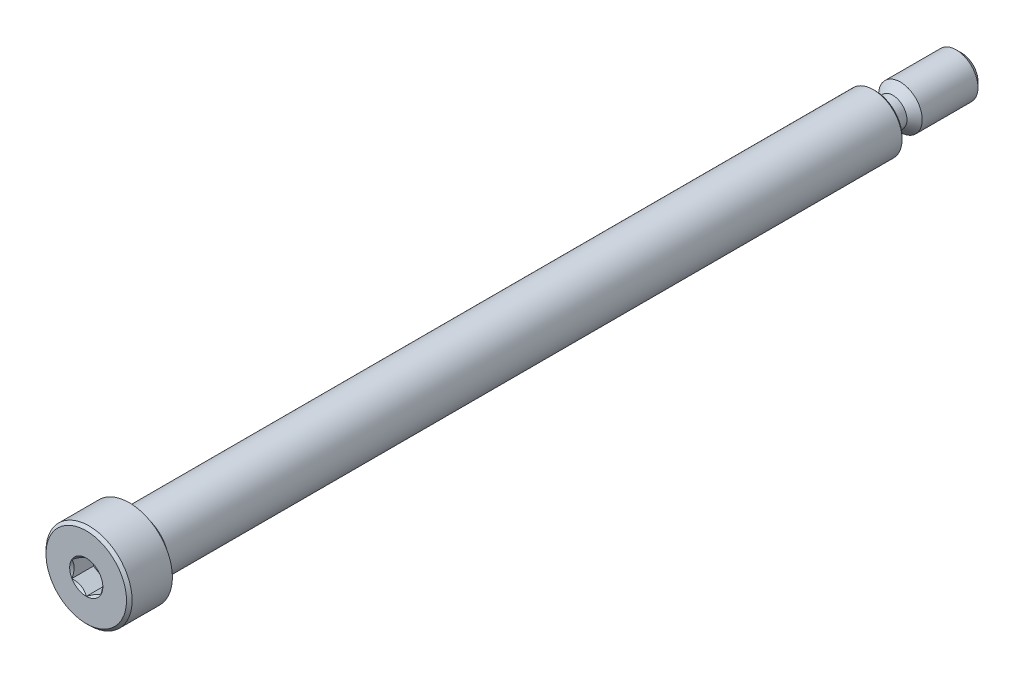
ISO-10303-21;
HEADER;
FILE_DESCRIPTION(('STEP AP214'),'2;1');
FILE_NAME('part.step','',(''),(''),'','','');
FILE_SCHEMA(('AUTOMOTIVE_DESIGN { 1 0 10303 214 1 1 1 1 }'));
ENDSEC;
DATA;
#1=APPLICATION_CONTEXT('core data for automotive mechanical design processes');
#2=APPLICATION_PROTOCOL_DEFINITION('international standard','automotive_design',2000,#1);
#3=PRODUCT_CONTEXT('',#1,'mechanical');
#4=PRODUCT('Part','Part','',(#3));
#5=PRODUCT_RELATED_PRODUCT_CATEGORY('part','',(#4));
#6=PRODUCT_DEFINITION_FORMATION('','',#4);
#7=PRODUCT_DEFINITION_CONTEXT('part definition',#1,'design');
#8=PRODUCT_DEFINITION('design','',#6,#7);
#9=PRODUCT_DEFINITION_SHAPE('','',#8);
#10=(LENGTH_UNIT() NAMED_UNIT(*) SI_UNIT(.MILLI.,.METRE.));
#11=(NAMED_UNIT(*) PLANE_ANGLE_UNIT() SI_UNIT($,.RADIAN.));
#12=(NAMED_UNIT(*) SI_UNIT($,.STERADIAN.) SOLID_ANGLE_UNIT());
#13=UNCERTAINTY_MEASURE_WITH_UNIT(LENGTH_MEASURE(1.E-05),#10,'distance_accuracy_value','');
#14=(GEOMETRIC_REPRESENTATION_CONTEXT(3) GLOBAL_UNCERTAINTY_ASSIGNED_CONTEXT((#13)) GLOBAL_UNIT_ASSIGNED_CONTEXT((#10,
#11,#12)) REPRESENTATION_CONTEXT('',''));
#15=CARTESIAN_POINT('',(0.,0.,0.));
#16=DIRECTION('',(0.,0.,1.));
#17=DIRECTION('',(1.,0.,0.));
#18=AXIS2_PLACEMENT_3D('',#15,#16,#17);
#19=CARTESIAN_POINT('',(0.,0.,-87.3125));
#20=DIRECTION('',(0.,0.,-1.));
#21=DIRECTION('',(-1.,0.,0.));
#22=AXIS2_PLACEMENT_3D('',#19,#20,#21);
#23=PLANE('',#22);
#24=CARTESIAN_POINT('',(0.,0.,-87.3125));
#25=DIRECTION('',(0.,0.,-1.));
#26=DIRECTION('',(-1.,0.,0.));
#27=AXIS2_PLACEMENT_3D('',#24,#25,#26);
#28=CIRCLE('',#27,1.83303333333333);
#29=CARTESIAN_POINT('',(-1.83303333333333,0.,-87.3125));
#30=VERTEX_POINT('',#29);
#31=EDGE_CURVE('E56',#30,#30,#28,.F.);
#32=ORIENTED_EDGE('',*,*,#31,.T.);
#33=EDGE_LOOP('',(#32));
#34=FACE_BOUND('',#33,.T.);
#35=CARTESIAN_POINT('',(0.,0.,-87.3125));
#36=DIRECTION('',(0.,0.,-1.));
#37=DIRECTION('',(-1.,0.,0.));
#38=AXIS2_PLACEMENT_3D('',#35,#36,#37);
#39=CIRCLE('',#38,2.93687499999999);
#40=CARTESIAN_POINT('',(-2.93687499999999,0.,-87.3125));
#41=VERTEX_POINT('',#40);
#42=EDGE_CURVE('E304',#41,#41,#39,.T.);
#43=ORIENTED_EDGE('',*,*,#42,.T.);
#44=EDGE_LOOP('',(#43));
#45=FACE_BOUND('',#44,.T.);
#46=ADVANCED_FACE('F41',(#34,#45),#23,.T.);
#47=CARTESIAN_POINT('',(0.,0.,-87.3125));
#48=DIRECTION('',(0.,0.,1.));
#49=DIRECTION('',(1.,0.,0.));
#50=AXIS2_PLACEMENT_3D('',#47,#48,#49);
#51=CONICAL_SURFACE('',#50,2.93687499999999,0.785398163397436);
#52=CARTESIAN_POINT('',(0.,0.,-87.074375));
#53=DIRECTION('',(0.,0.,-1.));
#54=DIRECTION('',(-1.,0.,0.));
#55=AXIS2_PLACEMENT_3D('',#52,#53,#54);
#56=CIRCLE('',#55,3.17499999999999);
#57=CARTESIAN_POINT('',(-3.17499999999999,0.,-87.074375));
#58=VERTEX_POINT('',#57);
#59=EDGE_CURVE('E300',#58,#58,#56,.T.);
#60=ORIENTED_EDGE('',*,*,#59,.T.);
#61=EDGE_LOOP('',(#60));
#62=FACE_BOUND('',#61,.T.);
#63=ORIENTED_EDGE('',*,*,#42,.F.);
#64=EDGE_LOOP('',(#63));
#65=FACE_BOUND('',#64,.T.);
#66=ADVANCED_FACE('F212',(#62,#65),#51,.T.);
#67=CARTESIAN_POINT('',(0.,0.,-87.3125));
#68=DIRECTION('',(0.,0.,-1.));
#69=DIRECTION('',(-1.,0.,0.));
#70=AXIS2_PLACEMENT_3D('',#67,#68,#69);
#71=CYLINDRICAL_SURFACE('',#70,3.17499999999999);
#72=CARTESIAN_POINT('',(0.,0.,-5.95312500000002));
#73=DIRECTION('',(0.,0.,-1.));
#74=DIRECTION('',(-1.,0.,0.));
#75=AXIS2_PLACEMENT_3D('',#72,#73,#74);
#76=CIRCLE('',#75,3.17499999999999);
#77=CARTESIAN_POINT('',(-3.17499999999999,0.,-5.95312500000002));
#78=VERTEX_POINT('',#77);
#79=EDGE_CURVE('E296',#78,#78,#76,.T.);
#80=ORIENTED_EDGE('',*,*,#79,.T.);
#81=EDGE_LOOP('',(#80));
#82=FACE_BOUND('',#81,.T.);
#83=ORIENTED_EDGE('',*,*,#59,.F.);
#84=EDGE_LOOP('',(#83));
#85=FACE_BOUND('',#84,.T.);
#86=ADVANCED_FACE('F218',(#82,#85),#71,.T.);
#87=CARTESIAN_POINT('',(0.,0.,-5.95312500000002));
#88=DIRECTION('',(0.,0.,-1.));
#89=DIRECTION('',(-1.,0.,0.));
#90=AXIS2_PLACEMENT_3D('',#87,#88,#89);
#91=CONICAL_SURFACE('',#90,3.17499999999999,0.785398163397436);
#92=CARTESIAN_POINT('',(0.,0.,-5.71500000000001));
#93=DIRECTION('',(0.,0.,-1.));
#94=DIRECTION('',(-1.,0.,0.));
#95=AXIS2_PLACEMENT_3D('',#92,#93,#94);
#96=CIRCLE('',#95,2.93687499999999);
#97=CARTESIAN_POINT('',(-2.93687499999999,0.,-5.71500000000001));
#98=VERTEX_POINT('',#97);
#99=EDGE_CURVE('E292',#98,#98,#96,.T.);
#100=ORIENTED_EDGE('',*,*,#99,.T.);
#101=EDGE_LOOP('',(#100));
#102=FACE_BOUND('',#101,.T.);
#103=ORIENTED_EDGE('',*,*,#79,.F.);
#104=EDGE_LOOP('',(#103));
#105=FACE_BOUND('',#104,.T.);
#106=ADVANCED_FACE('F333',(#102,#105),#91,.T.);
#107=CARTESIAN_POINT('',(0.,0.,-87.3125));
#108=DIRECTION('',(0.,0.,-1.));
#109=DIRECTION('',(-1.,0.,0.));
#110=AXIS2_PLACEMENT_3D('',#107,#108,#109);
#111=CYLINDRICAL_SURFACE('',#110,2.93687499999999);
#112=CARTESIAN_POINT('',(0.,0.,-4.7625));
#113=DIRECTION('',(0.,0.,-1.));
#114=DIRECTION('',(-1.,0.,0.));
#115=AXIS2_PLACEMENT_3D('',#112,#113,#114);
#116=CIRCLE('',#115,2.93687499999999);
#117=CARTESIAN_POINT('',(-2.93687499999999,0.,-4.7625));
#118=VERTEX_POINT('',#117);
#119=EDGE_CURVE('E288',#118,#118,#116,.T.);
#120=ORIENTED_EDGE('',*,*,#119,.T.);
#121=EDGE_LOOP('',(#120));
#122=FACE_BOUND('',#121,.T.);
#123=ORIENTED_EDGE('',*,*,#99,.F.);
#124=EDGE_LOOP('',(#123));
#125=FACE_BOUND('',#124,.T.);
#126=ADVANCED_FACE('F329',(#122,#125),#111,.T.);
#127=CARTESIAN_POINT('',(0.,4.76249999999999,-4.7625));
#128=DIRECTION('',(0.,0.,-1.));
#129=DIRECTION('',(-1.,0.,0.));
#130=AXIS2_PLACEMENT_3D('',#127,#128,#129);
#131=PLANE('',#130);
#132=CARTESIAN_POINT('',(0.,0.,-4.76249999999999));
#133=DIRECTION('',(0.,0.,-1.));
#134=DIRECTION('',(-1.,0.,0.));
#135=AXIS2_PLACEMENT_3D('',#132,#133,#134);
#136=CIRCLE('',#135,4.76249999999999);
#137=CARTESIAN_POINT('',(-4.76249999999999,0.,-4.76249999999999));
#138=VERTEX_POINT('',#137);
#139=EDGE_CURVE('E279',#138,#138,#136,.T.);
#140=ORIENTED_EDGE('',*,*,#139,.T.);
#141=EDGE_LOOP('',(#140));
#142=FACE_BOUND('',#141,.T.);
#143=ORIENTED_EDGE('',*,*,#119,.F.);
#144=EDGE_LOOP('',(#143));
#145=FACE_BOUND('',#144,.T.);
#146=ADVANCED_FACE('F326',(#142,#145),#131,.T.);
#147=CARTESIAN_POINT('',(0.,0.,-87.3125));
#148=DIRECTION('',(0.,0.,-1.));
#149=DIRECTION('',(-1.,0.,0.));
#150=AXIS2_PLACEMENT_3D('',#147,#148,#149);
#151=CYLINDRICAL_SURFACE('',#150,4.76249999999999);
#152=CARTESIAN_POINT('',(0.,0.,-0.309562499999999));
#153=DIRECTION('',(0.,0.,1.));
#154=DIRECTION('',(1.,0.,0.));
#155=AXIS2_PLACEMENT_3D('',#152,#153,#154);
#156=CIRCLE('',#155,4.76249999999999);
#157=CARTESIAN_POINT('',(4.76249999999999,0.,-0.309562499999999));
#158=VERTEX_POINT('',#157);
#159=EDGE_CURVE('E242',#158,#158,#156,.F.);
#160=ORIENTED_EDGE('',*,*,#159,.T.);
#161=EDGE_LOOP('',(#160));
#162=FACE_BOUND('',#161,.T.);
#163=ORIENTED_EDGE('',*,*,#139,.F.);
#164=EDGE_LOOP('',(#163));
#165=FACE_BOUND('',#164,.T.);
#166=ADVANCED_FACE('F323',(#162,#165),#151,.T.);
#167=CARTESIAN_POINT('',(0.,0.,0.));
#168=DIRECTION('',(0.,0.,1.));
#169=DIRECTION('',(1.,0.,0.));
#170=AXIS2_PLACEMENT_3D('',#167,#168,#169);
#171=PLANE('',#170);
#172=CARTESIAN_POINT('',(0.,0.,0.));
#173=DIRECTION('',(0.,0.,1.));
#174=DIRECTION('',(1.,0.,0.));
#175=AXIS2_PLACEMENT_3D('',#172,#173,#174);
#176=CIRCLE('',#175,1.83308710467706);
#177=CARTESIAN_POINT('',(1.5875,0.916543552338532,0.));
#178=VERTEX_POINT('',#177);
#179=CARTESIAN_POINT('',(0.,1.83308710467706,0.));
#180=VERTEX_POINT('',#179);
#181=EDGE_CURVE('E114',#178,#180,#176,.T.);
#182=ORIENTED_EDGE('',*,*,#181,.F.);
#183=CARTESIAN_POINT('',(1.5875,-0.916543552338531,0.));
#184=VERTEX_POINT('',#183);
#185=EDGE_CURVE('E102',#184,#178,#176,.T.);
#186=ORIENTED_EDGE('',*,*,#185,.F.);
#187=CARTESIAN_POINT('',(0.,-1.83308710467706,0.));
#188=VERTEX_POINT('',#187);
#189=EDGE_CURVE('E112',#188,#184,#176,.T.);
#190=ORIENTED_EDGE('',*,*,#189,.F.);
#191=CARTESIAN_POINT('',(-1.5875,-0.916543552338531,0.));
#192=VERTEX_POINT('',#191);
#193=EDGE_CURVE('E62',#192,#188,#176,.T.);
#194=ORIENTED_EDGE('',*,*,#193,.F.);
#195=CARTESIAN_POINT('',(-1.5875,0.916543552338531,0.));
#196=VERTEX_POINT('',#195);
#197=EDGE_CURVE('E69',#196,#192,#176,.T.);
#198=ORIENTED_EDGE('',*,*,#197,.F.);
#199=EDGE_CURVE('E143',#180,#196,#176,.T.);
#200=ORIENTED_EDGE('',*,*,#199,.F.);
#201=EDGE_LOOP('',(#182,#186,#190,#194,#198,#200));
#202=FACE_BOUND('',#201,.T.);
#203=CARTESIAN_POINT('',(0.,0.,0.));
#204=DIRECTION('',(0.,0.,1.));
#205=DIRECTION('',(1.,0.,0.));
#206=AXIS2_PLACEMENT_3D('',#203,#204,#205);
#207=CIRCLE('',#206,4.45293749999999);
#208=CARTESIAN_POINT('',(4.45293749999999,0.,0.));
#209=VERTEX_POINT('',#208);
#210=EDGE_CURVE('E239',#209,#209,#207,.T.);
#211=ORIENTED_EDGE('',*,*,#210,.T.);
#212=EDGE_LOOP('',(#211));
#213=FACE_BOUND('',#212,.T.);
#214=ADVANCED_FACE('F141',(#202,#213),#171,.T.);
#215=CARTESIAN_POINT('',(0.,0.,-89.2175));
#216=DIRECTION('',(0.,0.,-1.));
#217=DIRECTION('',(0.,1.,0.));
#218=AXIS2_PLACEMENT_3D('',#215,#216,#217);
#219=CONICAL_SURFACE('',#218,1.56844999999999,0.785398163397449);
#220=CARTESIAN_POINT('',(0.,0.,-90.06205));
#221=DIRECTION('',(0.,0.,-1.));
#222=DIRECTION('',(0.,1.,0.));
#223=AXIS2_PLACEMENT_3D('',#220,#221,#222);
#224=CIRCLE('',#223,2.41299999999999);
#225=CARTESIAN_POINT('',(0.,2.413,-90.06205));
#226=VERTEX_POINT('',#225);
#227=EDGE_CURVE('E274',#226,#226,#224,.T.);
#228=ORIENTED_EDGE('',*,*,#227,.F.);
#229=EDGE_LOOP('',(#228));
#230=FACE_BOUND('',#229,.T.);
#231=CARTESIAN_POINT('',(0.,0.,-89.2175));
#232=DIRECTION('',(0.,0.,-1.));
#233=DIRECTION('',(0.,1.,0.));
#234=AXIS2_PLACEMENT_3D('',#231,#232,#233);
#235=CIRCLE('',#234,1.56844999999999);
#236=CARTESIAN_POINT('',(0.,1.56845,-89.2175));
#237=VERTEX_POINT('',#236);
#238=EDGE_CURVE('E271',#237,#237,#235,.T.);
#239=ORIENTED_EDGE('',*,*,#238,.T.);
#240=EDGE_LOOP('',(#239));
#241=FACE_BOUND('',#240,.T.);
#242=ADVANCED_FACE('F267',(#230,#241),#219,.T.);
#243=CARTESIAN_POINT('',(0.,0.,-87.3125));
#244=DIRECTION('',(0.,0.,-1.));
#245=DIRECTION('',(0.,1.,0.));
#246=AXIS2_PLACEMENT_3D('',#243,#244,#245);
#247=CYLINDRICAL_SURFACE('',#246,1.56844999999999);
#248=CARTESIAN_POINT('',(0.,0.,-87.5770833333333));
#249=DIRECTION('',(0.,0.,-1.));
#250=DIRECTION('',(-1.,0.,0.));
#251=AXIS2_PLACEMENT_3D('',#248,#249,#250);
#252=CIRCLE('',#251,1.56844999999999);
#253=CARTESIAN_POINT('',(-1.56844999999999,0.,-87.5770833333333));
#254=VERTEX_POINT('',#253);
#255=EDGE_CURVE('E249',#254,#254,#252,.T.);
#256=ORIENTED_EDGE('',*,*,#255,.T.);
#257=EDGE_LOOP('',(#256));
#258=FACE_BOUND('',#257,.T.);
#259=ORIENTED_EDGE('',*,*,#238,.F.);
#260=EDGE_LOOP('',(#259));
#261=FACE_BOUND('',#260,.T.);
#262=ADVANCED_FACE('F263',(#258,#261),#247,.T.);
#263=CARTESIAN_POINT('',(0.,0.,-96.8375));
#264=DIRECTION('',(0.,0.,-1.));
#265=DIRECTION('',(-1.,0.,0.));
#266=AXIS2_PLACEMENT_3D('',#263,#264,#265);
#267=PLANE('',#266);
#268=CARTESIAN_POINT('',(0.,0.,-96.8375));
#269=DIRECTION('',(0.,0.,-1.));
#270=DIRECTION('',(-1.,0.,0.));
#271=AXIS2_PLACEMENT_3D('',#268,#269,#270);
#272=CIRCLE('',#271,1.80975);
#273=CARTESIAN_POINT('',(-1.80975,0.,-96.8375));
#274=VERTEX_POINT('',#273);
#275=EDGE_CURVE('E252',#274,#274,#272,.T.);
#276=ORIENTED_EDGE('',*,*,#275,.T.);
#277=EDGE_LOOP('',(#276));
#278=FACE_BOUND('',#277,.T.);
#279=ADVANCED_FACE('F266',(#278),#267,.T.);
#280=CARTESIAN_POINT('',(0.,0.,-96.8375));
#281=DIRECTION('',(0.,0.,1.));
#282=DIRECTION('',(1.,0.,0.));
#283=AXIS2_PLACEMENT_3D('',#280,#281,#282);
#284=CYLINDRICAL_SURFACE('',#283,2.413);
#285=CARTESIAN_POINT('',(0.,0.,-96.23425));
#286=DIRECTION('',(0.,0.,-1.));
#287=DIRECTION('',(-1.,0.,0.));
#288=AXIS2_PLACEMENT_3D('',#285,#286,#287);
#289=CIRCLE('',#288,2.413);
#290=CARTESIAN_POINT('',(-2.413,0.,-96.23425));
#291=VERTEX_POINT('',#290);
#292=EDGE_CURVE('E245',#291,#291,#289,.F.);
#293=ORIENTED_EDGE('',*,*,#292,.T.);
#294=EDGE_LOOP('',(#293));
#295=FACE_BOUND('',#294,.T.);
#296=ORIENTED_EDGE('',*,*,#227,.T.);
#297=EDGE_LOOP('',(#296));
#298=FACE_BOUND('',#297,.T.);
#299=ADVANCED_FACE('F228',(#295,#298),#284,.T.);
#300=CARTESIAN_POINT('',(0.,0.,-96.8375));
#301=DIRECTION('',(0.,0.,1.));
#302=DIRECTION('',(1.,0.,0.));
#303=AXIS2_PLACEMENT_3D('',#300,#301,#302);
#304=CONICAL_SURFACE('',#303,1.80975,0.78539816339745);
#305=ORIENTED_EDGE('',*,*,#292,.F.);
#306=EDGE_LOOP('',(#305));
#307=FACE_BOUND('',#306,.T.);
#308=ORIENTED_EDGE('',*,*,#275,.F.);
#309=EDGE_LOOP('',(#308));
#310=FACE_BOUND('',#309,.T.);
#311=ADVANCED_FACE('F225',(#307,#310),#304,.T.);
#312=CARTESIAN_POINT('',(0.,0.,-0.309562499999999));
#313=DIRECTION('',(0.,0.,-1.));
#314=DIRECTION('',(-1.,0.,0.));
#315=AXIS2_PLACEMENT_3D('',#312,#313,#314);
#316=CONICAL_SURFACE('',#315,4.76249999999999,0.785398163397451);
#317=ORIENTED_EDGE('',*,*,#210,.F.);
#318=EDGE_LOOP('',(#317));
#319=FACE_BOUND('',#318,.T.);
#320=ORIENTED_EDGE('',*,*,#159,.F.);
#321=EDGE_LOOP('',(#320));
#322=FACE_BOUND('',#321,.T.);
#323=ADVANCED_FACE('F227',(#319,#322),#316,.T.);
#324=CARTESIAN_POINT('',(0.,0.,-87.5770833333333));
#325=DIRECTION('',(0.,0.,-1.));
#326=DIRECTION('',(-1.,0.,0.));
#327=AXIS2_PLACEMENT_3D('',#324,#325,#326);
#328=TOROIDAL_SURFACE('',#327,1.83303333333333,0.264583333333335);
#329=ORIENTED_EDGE('',*,*,#31,.F.);
#330=EDGE_LOOP('',(#329));
#331=FACE_BOUND('',#330,.T.);
#332=ORIENTED_EDGE('',*,*,#255,.F.);
#333=EDGE_LOOP('',(#332));
#334=FACE_BOUND('',#333,.T.);
#335=ADVANCED_FACE('F43',(#331,#334),#328,.F.);
#336=CARTESIAN_POINT('',(0.,0.,0.));
#337=DIRECTION('',(0.,0.,1.));
#338=DIRECTION('',(1.,0.,0.));
#339=AXIS2_PLACEMENT_3D('',#336,#337,#338);
#340=CONICAL_SURFACE('',#339,1.83308710467706,0.78539816339745);
#341=ORIENTED_EDGE('',*,*,#181,.T.);
#342=CARTESIAN_POINT('',(1.5877,0.916428082284693,0.000115480963706964));
#343=CARTESIAN_POINT('',(1.53312479190086,0.947937093371809,-0.0313691916294029));
#344=CARTESIAN_POINT('',(1.47763696320971,0.979973006203395,-0.0610049539864698));
#345=CARTESIAN_POINT('',(1.36449087915364,1.04529792829092,-0.115267739979174));
#346=CARTESIAN_POINT('',(1.30682185887062,1.07859315267522,-0.139864564866823));
#347=CARTESIAN_POINT('',(1.1905349781269,1.14573141457583,-0.181999635727418));
#348=CARTESIAN_POINT('',(1.13194674474407,1.17955734689075,-0.199643807270178));
#349=CARTESIAN_POINT('',(1.01348022674557,1.24795402294714,-0.226828529915031));
#350=CARTESIAN_POINT('',(0.953605562983895,1.28252267618759,-0.236389379304922));
#351=CARTESIAN_POINT('',(0.850418771876558,1.34209759781022,-0.245015586895992));
#352=CARTESIAN_POINT('',(0.807240015952288,1.36702686416637,-0.246292807190423));
#353=CARTESIAN_POINT('',(0.720953038535399,1.41684467380557,-0.244142944185295));
#354=CARTESIAN_POINT('',(0.677844847078612,1.44173319974742,-0.240714211450656));
#355=CARTESIAN_POINT('',(0.592046335002031,1.49126899379091,-0.229349005566656));
#356=CARTESIAN_POINT('',(0.549356408925406,1.51591603410293,-0.221408628198358));
#357=CARTESIAN_POINT('',(0.464693063478359,1.56479643938728,-0.201451585548898));
#358=CARTESIAN_POINT('',(0.422719959755075,1.58902962212064,-0.189433170791309));
#359=CARTESIAN_POINT('',(0.315211458113567,1.65109968448354,-0.153753102752754));
#360=CARTESIAN_POINT('',(0.250342771708901,1.68855163804125,-0.127401427696863));
#361=CARTESIAN_POINT('',(0.154961599380925,1.74361998356043,-0.0829164631482979));
#362=CARTESIAN_POINT('',(0.123530699536157,1.76176662204668,-0.0672871421988685));
#363=CARTESIAN_POINT('',(0.0612469855696374,1.79772614107138,-0.0346015121388986));
#364=CARTESIAN_POINT('',(0.0303939039605769,1.8155391760437,-0.0175458843430301));
#365=CARTESIAN_POINT('',(-0.000199999999999737,1.8332025747309,0.000115480963706782));
#366=B_SPLINE_CURVE_WITH_KNOTS('',3,(#342,#343,#344,#345,#346,#347,#348,#349,#350,#351,#352,
#353,#354,#355,#356,#357,#358,#359,#360,#361,#362,#363,#364,#365),.UNSPECIFIED.,.F.,.F.,(4,2,2,
2,2,2,2,2,2,2,2,4),(0.,0.211482650810816,0.424197870807275,0.633533884524815,0.842342653263347,
0.99175555372714,1.14122083674204,1.29081565918877,1.44047473906437,1.6781878086972,
1.79671410024894,1.91518409436631),.UNSPECIFIED.);
#367=EDGE_CURVE('E11',#178,#180,#366,.T.);
#368=ORIENTED_EDGE('',*,*,#367,.F.);
#369=EDGE_LOOP('',(#341,#368));
#370=FACE_BOUND('',#369,.T.);
#371=ADVANCED_FACE('F117',(#370),#340,.F.);
#372=ORIENTED_EDGE('',*,*,#199,.T.);
#373=CARTESIAN_POINT('',(0.000200000000000091,1.8332025747309,0.000115480963706835));
#374=CARTESIAN_POINT('',(-0.0543752080991362,1.80169356364378,-0.031369191629403));
#375=CARTESIAN_POINT('',(-0.10986303679029,1.7696576508122,-0.0610049539864699));
#376=CARTESIAN_POINT('',(-0.223009120846359,1.70433272872467,-0.115267739979175));
#377=CARTESIAN_POINT('',(-0.280678141129381,1.67103750434037,-0.139864564866824));
#378=CARTESIAN_POINT('',(-0.396965021873103,1.60389924243976,-0.181999635727418));
#379=CARTESIAN_POINT('',(-0.455553255255931,1.57007331012484,-0.199643807270178));
#380=CARTESIAN_POINT('',(-0.57401977325443,1.50167663406845,-0.226828529915031));
#381=CARTESIAN_POINT('',(-0.633894437016104,1.46710798082801,-0.236389379304923));
#382=CARTESIAN_POINT('',(-0.737081228123442,1.40753305920537,-0.245015586895992));
#383=CARTESIAN_POINT('',(-0.780259984047712,1.38260379284922,-0.246292807190424));
#384=CARTESIAN_POINT('',(-0.866546961464601,1.33278598321002,-0.244142944185295));
#385=CARTESIAN_POINT('',(-0.909655152921387,1.30789745726817,-0.240714211450657));
#386=CARTESIAN_POINT('',(-0.995453664997969,1.25836166322468,-0.229349005566657));
#387=CARTESIAN_POINT('',(-1.03814359107459,1.23371462291266,-0.221408628198358));
#388=CARTESIAN_POINT('',(-1.12280693652164,1.18483421762831,-0.201451585548899));
#389=CARTESIAN_POINT('',(-1.16478004024492,1.16060103489495,-0.189433170791309));
#390=CARTESIAN_POINT('',(-1.27228854188643,1.09853097253205,-0.153753102752754));
#391=CARTESIAN_POINT('',(-1.3371572282911,1.06107901897434,-0.127401427696863));
#392=CARTESIAN_POINT('',(-1.43253840061908,1.00601067345516,-0.0829164631482979));
#393=CARTESIAN_POINT('',(-1.46396930046384,0.987864034968914,-0.0672871421988685));
#394=CARTESIAN_POINT('',(-1.52625301443036,0.951904515944214,-0.0346015121388984));
#395=CARTESIAN_POINT('',(-1.55710609603942,0.934091480971893,-0.01754588434303));
#396=CARTESIAN_POINT('',(-1.5877,0.916428082284693,0.000115480963706772));
#397=B_SPLINE_CURVE_WITH_KNOTS('',3,(#373,#374,#375,#376,#377,#378,#379,#380,#381,#382,#383,
#384,#385,#386,#387,#388,#389,#390,#391,#392,#393,#394,#395,#396),.UNSPECIFIED.,.F.,.F.,(4,2,2,
2,2,2,2,2,2,2,2,4),(0.,0.211482650810816,0.424197870807276,0.633533884524815,0.842342653263348,
0.991755553727141,1.14122083674204,1.29081565918877,1.44047473906437,1.6781878086972,
1.79671410024894,1.91518409436631),.UNSPECIFIED.);
#398=EDGE_CURVE('E145',#180,#196,#397,.T.);
#399=ORIENTED_EDGE('',*,*,#398,.F.);
#400=EDGE_LOOP('',(#372,#399));
#401=FACE_BOUND('',#400,.T.);
#402=ADVANCED_FACE('F471',(#401),#340,.F.);
#403=ORIENTED_EDGE('',*,*,#197,.T.);
#404=CARTESIAN_POINT('',(-1.5875,-1.82796193726258,0.587987263053254));
#405=CARTESIAN_POINT('',(-1.5875,-1.78345227615058,0.554386652482443));
#406=CARTESIAN_POINT('',(-1.5875,-1.73869460859013,0.521115495112814));
#407=CARTESIAN_POINT('',(-1.5875,-1.64858256596372,0.455368117663866));
#408=CARTESIAN_POINT('',(-1.5875,-1.60322804392557,0.422892099235914));
#409=CARTESIAN_POINT('',(-1.5875,-1.46545441976761,0.326397611985412));
#410=CARTESIAN_POINT('',(-1.5875,-1.372001913425,0.263830163460001));
#411=CARTESIAN_POINT('',(-1.5875,-1.17603564989744,0.141002804434967));
#412=CARTESIAN_POINT('',(-1.5875,-1.07330915468727,0.0810784496590998));
#413=CARTESIAN_POINT('',(-1.5875,-0.862725191083299,-0.0285359673271841));
#414=CARTESIAN_POINT('',(-1.5875,-0.754886591626394,-0.0782605310350665));
#415=CARTESIAN_POINT('',(-1.5875,-0.593019911814793,-0.139093925910705));
#416=CARTESIAN_POINT('',(-1.5875,-0.541388281953345,-0.156553547956912));
#417=CARTESIAN_POINT('',(-1.5875,-0.436878539644851,-0.187327632152254));
#418=CARTESIAN_POINT('',(-1.5875,-0.384000341596421,-0.200641808737997));
#419=CARTESIAN_POINT('',(-1.5875,-0.278196924179273,-0.222211694528002));
#420=CARTESIAN_POINT('',(-1.5875,-0.225289653780158,-0.230554072010504));
#421=CARTESIAN_POINT('',(-1.5875,-0.118909299444436,-0.242017482299472));
#422=CARTESIAN_POINT('',(-1.5875,-0.0654363143610316,-0.245139412645062));
#423=CARTESIAN_POINT('',(-1.5875,0.0396125417767726,-0.245930358907867));
#424=CARTESIAN_POINT('',(-1.5875,0.0911870236203157,-0.24379265698437));
#425=CARTESIAN_POINT('',(-1.5875,0.193894009138674,-0.234608631517597));
#426=CARTESIAN_POINT('',(-1.5875,0.245026469388834,-0.22756183112505));
#427=CARTESIAN_POINT('',(-1.5875,0.347344844875252,-0.208824783303616));
#428=CARTESIAN_POINT('',(-1.5875,0.39851606892843,-0.197055516419634));
#429=CARTESIAN_POINT('',(-1.5875,0.499740446124591,-0.169499053465114));
#430=CARTESIAN_POINT('',(-1.5875,0.549793692439816,-0.15371219359001));
#431=CARTESIAN_POINT('',(-1.5875,0.70738077418726,-0.0980702216941568));
#432=CARTESIAN_POINT('',(-1.5875,0.812671634229884,-0.0518781374254929));
#433=CARTESIAN_POINT('',(-1.5875,1.01830702558102,0.0508243359443609));
#434=CARTESIAN_POINT('',(-1.5875,1.11863208625861,0.107371795553089));
#435=CARTESIAN_POINT('',(-1.5875,1.3103677282283,0.22403419337149));
#436=CARTESIAN_POINT('',(-1.5875,1.40197355475198,0.283832216072681));
#437=CARTESIAN_POINT('',(-1.5875,1.53693633949296,0.376273802504081));
#438=CARTESIAN_POINT('',(-1.5875,1.58134147344183,0.407413627936379));
#439=CARTESIAN_POINT('',(-1.5875,1.66954488852479,0.470516819770574));
#440=CARTESIAN_POINT('',(-1.5875,1.7133433331845,0.502479957344863));
#441=CARTESIAN_POINT('',(-1.5875,1.75688919237298,0.534784489028341));
#442=B_SPLINE_CURVE_WITH_KNOTS('',3,(#404,#405,#406,#407,#408,#409,#410,#411,#412,#413,#414,
#415,#416,#417,#418,#419,#420,#421,#422,#423,#424,#425,#426,#427,#428,#429,#430,#431,#432,#433,
#434,#435,#436,#437,#438,#439,#440,#441),.UNSPECIFIED.,.F.,.F.,(4,2,2,2,2,2,2,2,2,2,2,2,2,2,2,2,
2,2,4),(0.,0.167300856006657,0.334643709885255,0.671883358358864,1.02837224619093,
1.38363464340872,1.54700775526169,1.7103921187555,1.87083807337658,2.03125644006703,
2.18586834446827,2.34049526931701,2.49782525404181,2.65514207759267,2.99906299922329,
3.34424006226481,3.67226428573992,3.83496498308972,3.99762093796191),.UNSPECIFIED.);
#443=EDGE_CURVE('E149',#196,#192,#442,.F.);
#444=ORIENTED_EDGE('',*,*,#443,.F.);
#445=EDGE_LOOP('',(#403,#444));
#446=FACE_BOUND('',#445,.T.);
#447=ADVANCED_FACE('F463',(#446),#340,.F.);
#448=ORIENTED_EDGE('',*,*,#193,.T.);
#449=CARTESIAN_POINT('',(-1.5877,-0.916428082284693,0.000115480963706531));
#450=CARTESIAN_POINT('',(-1.53312479190086,-0.94793709337181,-0.0313691916294031));
#451=CARTESIAN_POINT('',(-1.47763696320971,-0.979973006203395,-0.0610049539864699));
#452=CARTESIAN_POINT('',(-1.36449087915364,-1.04529792829092,-0.115267739979175));
#453=CARTESIAN_POINT('',(-1.30682185887062,-1.07859315267522,-0.139864564866823));
#454=CARTESIAN_POINT('',(-1.1905349781269,-1.14573141457583,-0.181999635727418));
#455=CARTESIAN_POINT('',(-1.13194674474407,-1.17955734689075,-0.199643807270178));
#456=CARTESIAN_POINT('',(-1.01348022674557,-1.24795402294714,-0.226828529915031));
#457=CARTESIAN_POINT('',(-0.953605562983895,-1.28252267618759,-0.236389379304922));
#458=CARTESIAN_POINT('',(-0.850418771876558,-1.34209759781022,-0.245015586895992));
#459=CARTESIAN_POINT('',(-0.807240015952288,-1.36702686416637,-0.246292807190424));
#460=CARTESIAN_POINT('',(-0.720953038535399,-1.41684467380557,-0.244142944185295));
#461=CARTESIAN_POINT('',(-0.677844847078612,-1.44173319974742,-0.240714211450656));
#462=CARTESIAN_POINT('',(-0.592046335002031,-1.49126899379091,-0.229349005566656));
#463=CARTESIAN_POINT('',(-0.549356408925407,-1.51591603410293,-0.221408628198358));
#464=CARTESIAN_POINT('',(-0.464693063478359,-1.56479643938728,-0.201451585548898));
#465=CARTESIAN_POINT('',(-0.422719959755075,-1.58902962212064,-0.189433170791309));
#466=CARTESIAN_POINT('',(-0.315211458113567,-1.65109968448354,-0.153753102752754));
#467=CARTESIAN_POINT('',(-0.250342771708901,-1.68855163804125,-0.127401427696863));
#468=CARTESIAN_POINT('',(-0.154961599380924,-1.74361998356043,-0.082916463148298));
#469=CARTESIAN_POINT('',(-0.123530699536157,-1.76176662204668,-0.0672871421988685));
#470=CARTESIAN_POINT('',(-0.0612469855696371,-1.79772614107138,-0.0346015121388984));
#471=CARTESIAN_POINT('',(-0.0303939039605766,-1.8155391760437,-0.01754588434303));
#472=CARTESIAN_POINT('',(0.000200000000000175,-1.8332025747309,0.000115480963706782));
#473=B_SPLINE_CURVE_WITH_KNOTS('',3,(#449,#450,#451,#452,#453,#454,#455,#456,#457,#458,#459,
#460,#461,#462,#463,#464,#465,#466,#467,#468,#469,#470,#471,#472),.UNSPECIFIED.,.F.,.F.,(4,2,2,
2,2,2,2,2,2,2,2,4),(0.,0.211482650810816,0.424197870807275,0.633533884524814,0.842342653263347,
0.99175555372714,1.14122083674204,1.29081565918877,1.44047473906437,1.6781878086972,
1.79671410024894,1.91518409436631),.UNSPECIFIED.);
#474=EDGE_CURVE('E176',#192,#188,#473,.T.);
#475=ORIENTED_EDGE('',*,*,#474,.F.);
#476=EDGE_LOOP('',(#448,#475));
#477=FACE_BOUND('',#476,.T.);
#478=ADVANCED_FACE('F454',(#477),#340,.F.);
#479=ORIENTED_EDGE('',*,*,#189,.T.);
#480=CARTESIAN_POINT('',(-0.000199999999999831,-1.8332025747309,0.000115480963707052));
#481=CARTESIAN_POINT('',(0.0543752080991365,-1.80169356364378,-0.0313691916294028));
#482=CARTESIAN_POINT('',(0.10986303679029,-1.7696576508122,-0.0610049539864698));
#483=CARTESIAN_POINT('',(0.223009120846359,-1.70433272872467,-0.115267739979175));
#484=CARTESIAN_POINT('',(0.280678141129381,-1.67103750434037,-0.139864564866823));
#485=CARTESIAN_POINT('',(0.396965021873103,-1.60389924243976,-0.181999635727418));
#486=CARTESIAN_POINT('',(0.455553255255931,-1.57007331012484,-0.199643807270178));
#487=CARTESIAN_POINT('',(0.574019773254431,-1.50167663406845,-0.226828529915031));
#488=CARTESIAN_POINT('',(0.633894437016105,-1.46710798082801,-0.236389379304922));
#489=CARTESIAN_POINT('',(0.737081228123443,-1.40753305920537,-0.245015586895992));
#490=CARTESIAN_POINT('',(0.780259984047712,-1.38260379284922,-0.246292807190424));
#491=CARTESIAN_POINT('',(0.866546961464602,-1.33278598321002,-0.244142944185295));
#492=CARTESIAN_POINT('',(0.909655152921388,-1.30789745726817,-0.240714211450656));
#493=CARTESIAN_POINT('',(0.99545366499797,-1.25836166322468,-0.229349005566656));
#494=CARTESIAN_POINT('',(1.03814359107459,-1.23371462291266,-0.221408628198358));
#495=CARTESIAN_POINT('',(1.12280693652164,-1.18483421762831,-0.201451585548898));
#496=CARTESIAN_POINT('',(1.16478004024493,-1.16060103489495,-0.189433170791309));
#497=CARTESIAN_POINT('',(1.27228854188643,-1.09853097253205,-0.153753102752754));
#498=CARTESIAN_POINT('',(1.3371572282911,-1.06107901897434,-0.127401427696863));
#499=CARTESIAN_POINT('',(1.43253840061908,-1.00601067345516,-0.0829164631482978));
#500=CARTESIAN_POINT('',(1.46396930046384,-0.987864034968914,-0.0672871421988685));
#501=CARTESIAN_POINT('',(1.52625301443036,-0.951904515944214,-0.0346015121388987));
#502=CARTESIAN_POINT('',(1.55710609603942,-0.934091480971894,-0.0175458843430303));
#503=CARTESIAN_POINT('',(1.5877,-0.916428082284693,0.000115480963706541));
#504=B_SPLINE_CURVE_WITH_KNOTS('',3,(#480,#481,#482,#483,#484,#485,#486,#487,#488,#489,#490,
#491,#492,#493,#494,#495,#496,#497,#498,#499,#500,#501,#502,#503),.UNSPECIFIED.,.F.,.F.,(4,2,2,
2,2,2,2,2,2,2,2,4),(0.,0.211482650810816,0.424197870807276,0.633533884524815,0.842342653263348,
0.991755553727141,1.14122083674205,1.29081565918877,1.44047473906438,1.6781878086972,
1.79671410024894,1.91518409436631),.UNSPECIFIED.);
#505=EDGE_CURVE('E130',#188,#184,#504,.T.);
#506=ORIENTED_EDGE('',*,*,#505,.F.);
#507=EDGE_LOOP('',(#479,#506));
#508=FACE_BOUND('',#507,.T.);
#509=ADVANCED_FACE('F169',(#508),#340,.F.);
#510=ORIENTED_EDGE('',*,*,#185,.T.);
#511=CARTESIAN_POINT('',(1.5875,-1.82796193726258,0.587987263053254));
#512=CARTESIAN_POINT('',(1.5875,-1.78345227615058,0.554386652482443));
#513=CARTESIAN_POINT('',(1.5875,-1.73869460859013,0.521115495112814));
#514=CARTESIAN_POINT('',(1.5875,-1.64858256596372,0.455368117663866));
#515=CARTESIAN_POINT('',(1.5875,-1.60322804392557,0.422892099235914));
#516=CARTESIAN_POINT('',(1.5875,-1.46545441976761,0.326397611985412));
#517=CARTESIAN_POINT('',(1.5875,-1.372001913425,0.263830163460001));
#518=CARTESIAN_POINT('',(1.5875,-1.17603564989744,0.141002804434966));
#519=CARTESIAN_POINT('',(1.5875,-1.07330915468727,0.0810784496590999));
#520=CARTESIAN_POINT('',(1.5875,-0.862725191083299,-0.0285359673271841));
#521=CARTESIAN_POINT('',(1.5875,-0.754886591626393,-0.0782605310350666));
#522=CARTESIAN_POINT('',(1.5875,-0.593019911814793,-0.139093925910705));
#523=CARTESIAN_POINT('',(1.5875,-0.541388281953345,-0.156553547956912));
#524=CARTESIAN_POINT('',(1.5875,-0.43687853964485,-0.187327632152254));
#525=CARTESIAN_POINT('',(1.5875,-0.38400034159642,-0.200641808737997));
#526=CARTESIAN_POINT('',(1.5875,-0.278196924179273,-0.222211694528002));
#527=CARTESIAN_POINT('',(1.5875,-0.225289653780157,-0.230554072010504));
#528=CARTESIAN_POINT('',(1.5875,-0.118909299444436,-0.242017482299472));
#529=CARTESIAN_POINT('',(1.5875,-0.0654363143610317,-0.245139412645062));
#530=CARTESIAN_POINT('',(1.5875,0.0396125417767726,-0.245930358907868));
#531=CARTESIAN_POINT('',(1.5875,0.0911870236203157,-0.24379265698437));
#532=CARTESIAN_POINT('',(1.5875,0.193894009138674,-0.234608631517598));
#533=CARTESIAN_POINT('',(1.5875,0.245026469388834,-0.22756183112505));
#534=CARTESIAN_POINT('',(1.5875,0.347344844875252,-0.208824783303616));
#535=CARTESIAN_POINT('',(1.5875,0.39851606892843,-0.197055516419634));
#536=CARTESIAN_POINT('',(1.5875,0.499740446124591,-0.169499053465114));
#537=CARTESIAN_POINT('',(1.5875,0.549793692439817,-0.15371219359001));
#538=CARTESIAN_POINT('',(1.5875,0.70738077418726,-0.098070221694157));
#539=CARTESIAN_POINT('',(1.5875,0.812671634229884,-0.0518781374254931));
#540=CARTESIAN_POINT('',(1.5875,1.01830702558102,0.0508243359443606));
#541=CARTESIAN_POINT('',(1.5875,1.11863208625861,0.107371795553089));
#542=CARTESIAN_POINT('',(1.5875,1.3103677282283,0.22403419337149));
#543=CARTESIAN_POINT('',(1.5875,1.40197355475198,0.28383221607268));
#544=CARTESIAN_POINT('',(1.5875,1.53693633949296,0.37627380250408));
#545=CARTESIAN_POINT('',(1.5875,1.58134147344183,0.407413627936378));
#546=CARTESIAN_POINT('',(1.5875,1.66954488852479,0.470516819770574));
#547=CARTESIAN_POINT('',(1.5875,1.7133433331845,0.502479957344862));
#548=CARTESIAN_POINT('',(1.5875,1.75688919237298,0.53478448902834));
#549=B_SPLINE_CURVE_WITH_KNOTS('',3,(#511,#512,#513,#514,#515,#516,#517,#518,#519,#520,#521,
#522,#523,#524,#525,#526,#527,#528,#529,#530,#531,#532,#533,#534,#535,#536,#537,#538,#539,#540,
#541,#542,#543,#544,#545,#546,#547,#548),.UNSPECIFIED.,.F.,.F.,(4,2,2,2,2,2,2,2,2,2,2,2,2,2,2,2,
2,2,4),(0.,0.167300856006658,0.334643709885256,0.671883358358865,1.02837224619093,
1.38363464340873,1.54700775526169,1.7103921187555,1.87083807337658,2.03125644006703,
2.18586834446827,2.34049526931701,2.49782525404182,2.65514207759268,2.99906299922329,
3.34424006226481,3.67226428573992,3.83496498308972,3.99762093796191),.UNSPECIFIED.);
#550=EDGE_CURVE('E106',#184,#178,#549,.T.);
#551=ORIENTED_EDGE('',*,*,#550,.F.);
#552=EDGE_LOOP('',(#510,#551));
#553=FACE_BOUND('',#552,.T.);
#554=ADVANCED_FACE('F104',(#553),#340,.F.);
#555=CARTESIAN_POINT('',(0.,0.,-2.38125));
#556=DIRECTION('',(0.,0.,1.));
#557=DIRECTION('',(1.,0.,0.));
#558=AXIS2_PLACEMENT_3D('',#555,#556,#557);
#559=PLANE('',#558);
#560=DIRECTION('',(0.,1.,0.));
#561=VECTOR('',#560,1.);
#562=CARTESIAN_POINT('',(1.5875,-0.916543552338531,-2.38125));
#563=LINE('',#562,#561);
#564=CARTESIAN_POINT('',(1.5875,-0.916543552338531,-2.38125));
#565=VERTEX_POINT('',#564);
#566=CARTESIAN_POINT('',(1.5875,0.916543552338531,-2.38125));
#567=VERTEX_POINT('',#566);
#568=EDGE_CURVE('E129',#565,#567,#563,.T.);
#569=ORIENTED_EDGE('',*,*,#568,.T.);
#570=DIRECTION('',(-0.866025403784439,0.5,0.));
#571=VECTOR('',#570,1.);
#572=CARTESIAN_POINT('',(1.5875,0.916543552338531,-2.38125));
#573=LINE('',#572,#571);
#574=CARTESIAN_POINT('',(0.,1.83308710467706,-2.38125));
#575=VERTEX_POINT('',#574);
#576=EDGE_CURVE('E134',#567,#575,#573,.T.);
#577=ORIENTED_EDGE('',*,*,#576,.T.);
#578=DIRECTION('',(-0.866025403784439,-0.5,0.));
#579=VECTOR('',#578,1.);
#580=CARTESIAN_POINT('',(0.,1.83308710467706,-2.38125));
#581=LINE('',#580,#579);
#582=CARTESIAN_POINT('',(-1.5875,0.916543552338531,-2.38125));
#583=VERTEX_POINT('',#582);
#584=EDGE_CURVE('E520',#575,#583,#581,.T.);
#585=ORIENTED_EDGE('',*,*,#584,.T.);
#586=DIRECTION('',(0.,-1.,0.));
#587=VECTOR('',#586,1.);
#588=CARTESIAN_POINT('',(-1.5875,0.916543552338531,-2.38125));
#589=LINE('',#588,#587);
#590=CARTESIAN_POINT('',(-1.5875,-0.916543552338531,-2.38125));
#591=VERTEX_POINT('',#590);
#592=EDGE_CURVE('E493',#583,#591,#589,.T.);
#593=ORIENTED_EDGE('',*,*,#592,.T.);
#594=DIRECTION('',(0.866025403784439,-0.5,0.));
#595=VECTOR('',#594,1.);
#596=CARTESIAN_POINT('',(-1.5875,-0.916543552338531,-2.38125));
#597=LINE('',#596,#595);
#598=CARTESIAN_POINT('',(0.,-1.83308710467706,-2.38125));
#599=VERTEX_POINT('',#598);
#600=EDGE_CURVE('E516',#591,#599,#597,.T.);
#601=ORIENTED_EDGE('',*,*,#600,.T.);
#602=DIRECTION('',(0.866025403784439,0.5,0.));
#603=VECTOR('',#602,1.);
#604=CARTESIAN_POINT('',(0.,-1.83308710467706,-2.38125));
#605=LINE('',#604,#603);
#606=EDGE_CURVE('E138',#599,#565,#605,.T.);
#607=ORIENTED_EDGE('',*,*,#606,.T.);
#608=EDGE_LOOP('',(#569,#577,#585,#593,#601,#607));
#609=FACE_BOUND('',#608,.T.);
#610=ADVANCED_FACE('F168',(#609),#559,.T.);
#611=CARTESIAN_POINT('',(1.5875,0.916543552338531,-2.38125));
#612=DIRECTION('',(0.5,0.866025403784439,0.));
#613=DIRECTION('',(-0.866025403784439,0.5,0.));
#614=AXIS2_PLACEMENT_3D('',#611,#612,#613);
#615=PLANE('',#614);
#616=DIRECTION('',(0.,0.,1.));
#617=VECTOR('',#616,1.);
#618=CARTESIAN_POINT('',(1.5875,0.916543552338531,-2.38125));
#619=LINE('',#618,#617);
#620=EDGE_CURVE('E124',#567,#178,#619,.T.);
#621=ORIENTED_EDGE('',*,*,#620,.T.);
#622=ORIENTED_EDGE('',*,*,#367,.T.);
#623=DIRECTION('',(0.,0.,1.));
#624=VECTOR('',#623,1.);
#625=CARTESIAN_POINT('',(0.,1.83308710467706,-2.38125));
#626=LINE('',#625,#624);
#627=EDGE_CURVE('E137',#575,#180,#626,.T.);
#628=ORIENTED_EDGE('',*,*,#627,.F.);
#629=ORIENTED_EDGE('',*,*,#576,.F.);
#630=EDGE_LOOP('',(#621,#622,#628,#629));
#631=FACE_BOUND('',#630,.T.);
#632=ADVANCED_FACE('F132',(#631),#615,.F.);
#633=CARTESIAN_POINT('',(0.,1.83308710467706,-2.38125));
#634=DIRECTION('',(-0.5,0.866025403784439,0.));
#635=DIRECTION('',(-0.866025403784439,-0.5,0.));
#636=AXIS2_PLACEMENT_3D('',#633,#634,#635);
#637=PLANE('',#636);
#638=ORIENTED_EDGE('',*,*,#627,.T.);
#639=ORIENTED_EDGE('',*,*,#398,.T.);
#640=DIRECTION('',(0.,0.,1.));
#641=VECTOR('',#640,1.);
#642=CARTESIAN_POINT('',(-1.5875,0.916543552338531,-2.38125));
#643=LINE('',#642,#641);
#644=EDGE_CURVE('E490',#583,#196,#643,.T.);
#645=ORIENTED_EDGE('',*,*,#644,.F.);
#646=ORIENTED_EDGE('',*,*,#584,.F.);
#647=EDGE_LOOP('',(#638,#639,#645,#646));
#648=FACE_BOUND('',#647,.T.);
#649=ADVANCED_FACE('F163',(#648),#637,.F.);
#650=CARTESIAN_POINT('',(-1.5875,0.916543552338531,-2.38125));
#651=DIRECTION('',(-1.,0.,0.));
#652=DIRECTION('',(0.,-1.,0.));
#653=AXIS2_PLACEMENT_3D('',#650,#651,#652);
#654=PLANE('',#653);
#655=ORIENTED_EDGE('',*,*,#644,.T.);
#656=ORIENTED_EDGE('',*,*,#443,.T.);
#657=DIRECTION('',(0.,0.,1.));
#658=VECTOR('',#657,1.);
#659=CARTESIAN_POINT('',(-1.5875,-0.916543552338531,-2.38125));
#660=LINE('',#659,#658);
#661=EDGE_CURVE('E496',#591,#192,#660,.T.);
#662=ORIENTED_EDGE('',*,*,#661,.F.);
#663=ORIENTED_EDGE('',*,*,#592,.F.);
#664=EDGE_LOOP('',(#655,#656,#662,#663));
#665=FACE_BOUND('',#664,.T.);
#666=ADVANCED_FACE('F201',(#665),#654,.F.);
#667=CARTESIAN_POINT('',(-1.5875,-0.916543552338531,-2.38125));
#668=DIRECTION('',(-0.5,-0.866025403784439,0.));
#669=DIRECTION('',(0.866025403784439,-0.5,0.));
#670=AXIS2_PLACEMENT_3D('',#667,#668,#669);
#671=PLANE('',#670);
#672=ORIENTED_EDGE('',*,*,#661,.T.);
#673=ORIENTED_EDGE('',*,*,#474,.T.);
#674=DIRECTION('',(0.,0.,1.));
#675=VECTOR('',#674,1.);
#676=CARTESIAN_POINT('',(0.,-1.83308710467706,-2.38125));
#677=LINE('',#676,#675);
#678=EDGE_CURVE('E281',#599,#188,#677,.T.);
#679=ORIENTED_EDGE('',*,*,#678,.F.);
#680=ORIENTED_EDGE('',*,*,#600,.F.);
#681=EDGE_LOOP('',(#672,#673,#679,#680));
#682=FACE_BOUND('',#681,.T.);
#683=ADVANCED_FACE('F197',(#682),#671,.F.);
#684=CARTESIAN_POINT('',(0.,-1.83308710467706,-2.38125));
#685=DIRECTION('',(0.5,-0.866025403784439,0.));
#686=DIRECTION('',(0.866025403784439,0.5,0.));
#687=AXIS2_PLACEMENT_3D('',#684,#685,#686);
#688=PLANE('',#687);
#689=ORIENTED_EDGE('',*,*,#678,.T.);
#690=ORIENTED_EDGE('',*,*,#505,.T.);
#691=DIRECTION('',(0.,0.,1.));
#692=VECTOR('',#691,1.);
#693=CARTESIAN_POINT('',(1.5875,-0.916543552338531,-2.38125));
#694=LINE('',#693,#692);
#695=EDGE_CURVE('E126',#565,#184,#694,.T.);
#696=ORIENTED_EDGE('',*,*,#695,.F.);
#697=ORIENTED_EDGE('',*,*,#606,.F.);
#698=EDGE_LOOP('',(#689,#690,#696,#697));
#699=FACE_BOUND('',#698,.T.);
#700=ADVANCED_FACE('F194',(#699),#688,.F.);
#701=CARTESIAN_POINT('',(1.5875,-0.916543552338531,-2.38125));
#702=DIRECTION('',(1.,0.,0.));
#703=DIRECTION('',(0.,1.,0.));
#704=AXIS2_PLACEMENT_3D('',#701,#702,#703);
#705=PLANE('',#704);
#706=ORIENTED_EDGE('',*,*,#695,.T.);
#707=ORIENTED_EDGE('',*,*,#550,.T.);
#708=ORIENTED_EDGE('',*,*,#620,.F.);
#709=ORIENTED_EDGE('',*,*,#568,.F.);
#710=EDGE_LOOP('',(#706,#707,#708,#709));
#711=FACE_BOUND('',#710,.T.);
#712=ADVANCED_FACE('F122',(#711),#705,.F.);
#713=CLOSED_SHELL('',(#46,#66,#86,#106,#126,#146,#166,#214,#242,#262,#279,#299,#311,#323,#335,
#371,#402,#447,#478,#509,#554,#610,#632,#649,#666,#683,#700,#712));
#714=MANIFOLD_SOLID_BREP('B2',#713);
#715=ADVANCED_BREP_SHAPE_REPRESENTATION('',(#18,#714),#14);
#716=SHAPE_DEFINITION_REPRESENTATION(#9,#715);
ENDSEC;
END-ISO-10303-21;
